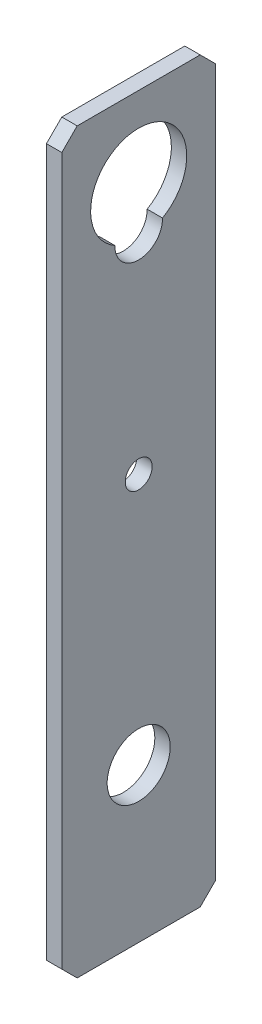
ISO-10303-21;
HEADER;
FILE_DESCRIPTION(('STEP AP214'),'2;1');
FILE_NAME('part.step','',(''),(''),'','','');
FILE_SCHEMA(('AUTOMOTIVE_DESIGN { 1 0 10303 214 1 1 1 1 }'));
ENDSEC;
DATA;
#1=APPLICATION_CONTEXT('core data for automotive mechanical design processes');
#2=APPLICATION_PROTOCOL_DEFINITION('international standard','automotive_design',2000,#1);
#3=PRODUCT_CONTEXT('',#1,'mechanical');
#4=PRODUCT('Part','Part','',(#3));
#5=PRODUCT_RELATED_PRODUCT_CATEGORY('part','',(#4));
#6=PRODUCT_DEFINITION_FORMATION('','',#4);
#7=PRODUCT_DEFINITION_CONTEXT('part definition',#1,'design');
#8=PRODUCT_DEFINITION('design','',#6,#7);
#9=PRODUCT_DEFINITION_SHAPE('','',#8);
#10=(LENGTH_UNIT() NAMED_UNIT(*) SI_UNIT(.MILLI.,.METRE.));
#11=(NAMED_UNIT(*) PLANE_ANGLE_UNIT() SI_UNIT($,.RADIAN.));
#12=(NAMED_UNIT(*) SI_UNIT($,.STERADIAN.) SOLID_ANGLE_UNIT());
#13=UNCERTAINTY_MEASURE_WITH_UNIT(LENGTH_MEASURE(1.E-05),#10,'distance_accuracy_value','');
#14=(GEOMETRIC_REPRESENTATION_CONTEXT(3) GLOBAL_UNCERTAINTY_ASSIGNED_CONTEXT((#13)) GLOBAL_UNIT_ASSIGNED_CONTEXT((#10,
#11,#12)) REPRESENTATION_CONTEXT('',''));
#15=CARTESIAN_POINT('',(0.,0.,0.));
#16=DIRECTION('',(0.,0.,1.));
#17=DIRECTION('',(1.,0.,0.));
#18=AXIS2_PLACEMENT_3D('',#15,#16,#17);
#19=CARTESIAN_POINT('',(2.,-48.,-10.));
#20=DIRECTION('',(0.,0.,1.));
#21=DIRECTION('',(1.,0.,0.));
#22=AXIS2_PLACEMENT_3D('',#19,#20,#21);
#23=PLANE('',#22);
#24=DIRECTION('',(0.,1.,0.));
#25=VECTOR('',#24,1.);
#26=CARTESIAN_POINT('',(2.,-48.,-10.));
#27=LINE('',#26,#25);
#28=CARTESIAN_POINT('',(2.,-46.,-10.));
#29=VERTEX_POINT('',#28);
#30=CARTESIAN_POINT('',(2.,46.,-10.));
#31=VERTEX_POINT('',#30);
#32=EDGE_CURVE('E170',#29,#31,#27,.T.);
#33=ORIENTED_EDGE('',*,*,#32,.F.);
#34=DIRECTION('',(-1.,0.,0.));
#35=VECTOR('',#34,1.);
#36=CARTESIAN_POINT('',(2.,-46.,-10.));
#37=LINE('',#36,#35);
#38=CARTESIAN_POINT('',(0.,-46.,-10.));
#39=VERTEX_POINT('',#38);
#40=EDGE_CURVE('E238',#29,#39,#37,.T.);
#41=ORIENTED_EDGE('',*,*,#40,.T.);
#42=DIRECTION('',(0.,1.,0.));
#43=VECTOR('',#42,1.);
#44=CARTESIAN_POINT('',(0.,-48.,-10.));
#45=LINE('',#44,#43);
#46=CARTESIAN_POINT('',(0.,46.,-10.));
#47=VERTEX_POINT('',#46);
#48=EDGE_CURVE('E165',#39,#47,#45,.T.);
#49=ORIENTED_EDGE('',*,*,#48,.T.);
#50=DIRECTION('',(1.,0.,0.));
#51=VECTOR('',#50,1.);
#52=CARTESIAN_POINT('',(2.,46.,-10.));
#53=LINE('',#52,#51);
#54=EDGE_CURVE('E235',#47,#31,#53,.T.);
#55=ORIENTED_EDGE('',*,*,#54,.T.);
#56=EDGE_LOOP('',(#33,#41,#49,#55));
#57=FACE_BOUND('',#56,.T.);
#58=ADVANCED_FACE('F47',(#57),#23,.F.);
#59=CARTESIAN_POINT('',(2.,48.,10.));
#60=DIRECTION('',(0.,-1.,0.));
#61=DIRECTION('',(0.,0.,-1.));
#62=AXIS2_PLACEMENT_3D('',#59,#60,#61);
#63=PLANE('',#62);
#64=DIRECTION('',(0.,0.,1.));
#65=VECTOR('',#64,1.);
#66=CARTESIAN_POINT('',(2.,48.,10.));
#67=LINE('',#66,#65);
#68=CARTESIAN_POINT('',(2.,48.,-8.));
#69=VERTEX_POINT('',#68);
#70=CARTESIAN_POINT('',(2.,48.,7.99999999999999));
#71=VERTEX_POINT('',#70);
#72=EDGE_CURVE('E173',#69,#71,#67,.T.);
#73=ORIENTED_EDGE('',*,*,#72,.F.);
#74=DIRECTION('',(-1.,0.,0.));
#75=VECTOR('',#74,1.);
#76=CARTESIAN_POINT('',(2.,48.,-8.));
#77=LINE('',#76,#75);
#78=CARTESIAN_POINT('',(0.,48.,-8.));
#79=VERTEX_POINT('',#78);
#80=EDGE_CURVE('E11',#69,#79,#77,.T.);
#81=ORIENTED_EDGE('',*,*,#80,.T.);
#82=DIRECTION('',(0.,0.,1.));
#83=VECTOR('',#82,1.);
#84=CARTESIAN_POINT('',(0.,48.,10.));
#85=LINE('',#84,#83);
#86=CARTESIAN_POINT('',(0.,48.,7.99999999999999));
#87=VERTEX_POINT('',#86);
#88=EDGE_CURVE('E189',#79,#87,#85,.T.);
#89=ORIENTED_EDGE('',*,*,#88,.T.);
#90=DIRECTION('',(1.,0.,0.));
#91=VECTOR('',#90,1.);
#92=CARTESIAN_POINT('',(2.,48.,7.99999999999999));
#93=LINE('',#92,#91);
#94=EDGE_CURVE('E57',#87,#71,#93,.T.);
#95=ORIENTED_EDGE('',*,*,#94,.T.);
#96=EDGE_LOOP('',(#73,#81,#89,#95));
#97=FACE_BOUND('',#96,.T.);
#98=ADVANCED_FACE('F283',(#97),#63,.F.);
#99=CARTESIAN_POINT('',(2.,-48.,10.));
#100=DIRECTION('',(0.,0.,-1.));
#101=DIRECTION('',(-1.,0.,0.));
#102=AXIS2_PLACEMENT_3D('',#99,#100,#101);
#103=PLANE('',#102);
#104=DIRECTION('',(0.,-1.,0.));
#105=VECTOR('',#104,1.);
#106=CARTESIAN_POINT('',(0.,-48.,10.));
#107=LINE('',#106,#105);
#108=CARTESIAN_POINT('',(0.,46.,10.));
#109=VERTEX_POINT('',#108);
#110=CARTESIAN_POINT('',(0.,-46.,10.));
#111=VERTEX_POINT('',#110);
#112=EDGE_CURVE('E192',#109,#111,#107,.T.);
#113=ORIENTED_EDGE('',*,*,#112,.T.);
#114=DIRECTION('',(1.,0.,0.));
#115=VECTOR('',#114,1.);
#116=CARTESIAN_POINT('',(2.,-46.,10.));
#117=LINE('',#116,#115);
#118=CARTESIAN_POINT('',(2.,-46.,10.));
#119=VERTEX_POINT('',#118);
#120=EDGE_CURVE('E221',#111,#119,#117,.T.);
#121=ORIENTED_EDGE('',*,*,#120,.T.);
#122=DIRECTION('',(0.,-1.,0.));
#123=VECTOR('',#122,1.);
#124=CARTESIAN_POINT('',(2.,-48.,10.));
#125=LINE('',#124,#123);
#126=CARTESIAN_POINT('',(2.,46.,10.));
#127=VERTEX_POINT('',#126);
#128=EDGE_CURVE('E177',#127,#119,#125,.T.);
#129=ORIENTED_EDGE('',*,*,#128,.F.);
#130=DIRECTION('',(-1.,0.,0.));
#131=VECTOR('',#130,1.);
#132=CARTESIAN_POINT('',(2.,46.,10.));
#133=LINE('',#132,#131);
#134=EDGE_CURVE('E217',#127,#109,#133,.T.);
#135=ORIENTED_EDGE('',*,*,#134,.T.);
#136=EDGE_LOOP('',(#113,#121,#129,#135));
#137=FACE_BOUND('',#136,.T.);
#138=ADVANCED_FACE('F285',(#137),#103,.F.);
#139=CARTESIAN_POINT('',(2.,-48.,10.));
#140=DIRECTION('',(0.,1.,0.));
#141=DIRECTION('',(0.,0.,1.));
#142=AXIS2_PLACEMENT_3D('',#139,#140,#141);
#143=PLANE('',#142);
#144=DIRECTION('',(0.,0.,-1.));
#145=VECTOR('',#144,1.);
#146=CARTESIAN_POINT('',(2.,-48.,10.));
#147=LINE('',#146,#145);
#148=CARTESIAN_POINT('',(2.,-48.,8.));
#149=VERTEX_POINT('',#148);
#150=CARTESIAN_POINT('',(2.,-48.,-7.99999999999998));
#151=VERTEX_POINT('',#150);
#152=EDGE_CURVE('E181',#149,#151,#147,.T.);
#153=ORIENTED_EDGE('',*,*,#152,.F.);
#154=DIRECTION('',(-1.,0.,0.));
#155=VECTOR('',#154,1.);
#156=CARTESIAN_POINT('',(2.,-48.,8.));
#157=LINE('',#156,#155);
#158=CARTESIAN_POINT('',(0.,-48.,8.));
#159=VERTEX_POINT('',#158);
#160=EDGE_CURVE('E201',#149,#159,#157,.T.);
#161=ORIENTED_EDGE('',*,*,#160,.T.);
#162=DIRECTION('',(0.,0.,-1.));
#163=VECTOR('',#162,1.);
#164=CARTESIAN_POINT('',(0.,-48.,10.));
#165=LINE('',#164,#163);
#166=CARTESIAN_POINT('',(0.,-48.,-7.99999999999998));
#167=VERTEX_POINT('',#166);
#168=EDGE_CURVE('E174',#159,#167,#165,.T.);
#169=ORIENTED_EDGE('',*,*,#168,.T.);
#170=DIRECTION('',(1.,0.,0.));
#171=VECTOR('',#170,1.);
#172=CARTESIAN_POINT('',(2.,-48.,-7.99999999999998));
#173=LINE('',#172,#171);
#174=EDGE_CURVE('E185',#167,#151,#173,.T.);
#175=ORIENTED_EDGE('',*,*,#174,.T.);
#176=EDGE_LOOP('',(#153,#161,#169,#175));
#177=FACE_BOUND('',#176,.T.);
#178=ADVANCED_FACE('F253',(#177),#143,.F.);
#179=CARTESIAN_POINT('',(2.,0.,0.));
#180=DIRECTION('',(-1.,0.,0.));
#181=DIRECTION('',(0.,0.,1.));
#182=AXIS2_PLACEMENT_3D('',#179,#180,#181);
#183=PLANE('',#182);
#184=CARTESIAN_POINT('',(2.,37.5,0.));
#185=DIRECTION('',(1.,0.,0.));
#186=DIRECTION('',(0.,0.,-1.));
#187=AXIS2_PLACEMENT_3D('',#184,#185,#186);
#188=CIRCLE('',#187,6.25);
#189=CARTESIAN_POINT('',(2.,32.0725,-3.09915210178526));
#190=VERTEX_POINT('',#189);
#191=CARTESIAN_POINT('',(2.,32.0725,3.09915210178526));
#192=VERTEX_POINT('',#191);
#193=EDGE_CURVE('E141',#190,#192,#188,.T.);
#194=ORIENTED_EDGE('',*,*,#193,.F.);
#195=CARTESIAN_POINT('',(2.,32.,0.));
#196=DIRECTION('',(1.,0.,0.));
#197=DIRECTION('',(0.,0.,-1.));
#198=AXIS2_PLACEMENT_3D('',#195,#196,#197);
#199=CIRCLE('',#198,3.1);
#200=EDGE_CURVE('E130',#192,#190,#199,.T.);
#201=ORIENTED_EDGE('',*,*,#200,.F.);
#202=EDGE_LOOP('',(#194,#201));
#203=FACE_BOUND('',#202,.T.);
#204=CARTESIAN_POINT('',(2.,-28.,0.));
#205=DIRECTION('',(1.,0.,0.));
#206=DIRECTION('',(0.,0.,-1.));
#207=AXIS2_PLACEMENT_3D('',#204,#205,#206);
#208=CIRCLE('',#207,4.1);
#209=CARTESIAN_POINT('',(2.,-28.,-4.1));
#210=VERTEX_POINT('',#209);
#211=EDGE_CURVE('E153',#210,#210,#208,.T.);
#212=ORIENTED_EDGE('',*,*,#211,.F.);
#213=EDGE_LOOP('',(#212));
#214=FACE_BOUND('',#213,.T.);
#215=CARTESIAN_POINT('',(2.,4.74999999999999,0.));
#216=DIRECTION('',(1.,0.,0.));
#217=DIRECTION('',(0.,0.,-1.));
#218=AXIS2_PLACEMENT_3D('',#215,#216,#217);
#219=CIRCLE('',#218,1.75);
#220=CARTESIAN_POINT('',(2.,4.74999999999999,-1.75));
#221=VERTEX_POINT('',#220);
#222=EDGE_CURVE('E166',#221,#221,#219,.T.);
#223=ORIENTED_EDGE('',*,*,#222,.F.);
#224=EDGE_LOOP('',(#223));
#225=FACE_BOUND('',#224,.T.);
#226=ORIENTED_EDGE('',*,*,#128,.T.);
#227=DIRECTION('',(0.,0.70710678118655,0.707106781186545));
#228=VECTOR('',#227,1.);
#229=CARTESIAN_POINT('',(2.,-48.,8.));
#230=LINE('',#229,#228);
#231=EDGE_CURVE('E232',#119,#149,#230,.F.);
#232=ORIENTED_EDGE('',*,*,#231,.T.);
#233=ORIENTED_EDGE('',*,*,#152,.T.);
#234=DIRECTION('',(0.,-0.707106781186545,0.70710678118655));
#235=VECTOR('',#234,1.);
#236=CARTESIAN_POINT('',(2.,-46.,-10.));
#237=LINE('',#236,#235);
#238=EDGE_CURVE('E229',#151,#29,#237,.F.);
#239=ORIENTED_EDGE('',*,*,#238,.T.);
#240=ORIENTED_EDGE('',*,*,#32,.T.);
#241=DIRECTION('',(0.,-0.70710678118655,-0.707106781186545));
#242=VECTOR('',#241,1.);
#243=CARTESIAN_POINT('',(2.,48.,-8.));
#244=LINE('',#243,#242);
#245=EDGE_CURVE('E70',#31,#69,#244,.F.);
#246=ORIENTED_EDGE('',*,*,#245,.T.);
#247=ORIENTED_EDGE('',*,*,#72,.T.);
#248=DIRECTION('',(0.,0.707106781186545,-0.70710678118655));
#249=VECTOR('',#248,1.);
#250=CARTESIAN_POINT('',(2.,46.,10.));
#251=LINE('',#250,#249);
#252=EDGE_CURVE('E224',#71,#127,#251,.F.);
#253=ORIENTED_EDGE('',*,*,#252,.T.);
#254=EDGE_LOOP('',(#226,#232,#233,#239,#240,#246,#247,#253));
#255=FACE_BOUND('',#254,.T.);
#256=ADVANCED_FACE('F146',(#203,#214,#225,#255),#183,.F.);
#257=CARTESIAN_POINT('',(0.,0.,0.));
#258=DIRECTION('',(-1.,0.,0.));
#259=DIRECTION('',(0.,0.,1.));
#260=AXIS2_PLACEMENT_3D('',#257,#258,#259);
#261=PLANE('',#260);
#262=CARTESIAN_POINT('',(0.,32.,0.));
#263=DIRECTION('',(1.,0.,0.));
#264=DIRECTION('',(0.,0.,-1.));
#265=AXIS2_PLACEMENT_3D('',#262,#263,#264);
#266=CIRCLE('',#265,3.1);
#267=CARTESIAN_POINT('',(0.,32.0725,3.09915210178526));
#268=VERTEX_POINT('',#267);
#269=CARTESIAN_POINT('',(0.,32.0725,-3.09915210178526));
#270=VERTEX_POINT('',#269);
#271=EDGE_CURVE('E133',#268,#270,#266,.T.);
#272=ORIENTED_EDGE('',*,*,#271,.T.);
#273=CARTESIAN_POINT('',(0.,37.5,0.));
#274=DIRECTION('',(1.,0.,0.));
#275=DIRECTION('',(0.,0.,-1.));
#276=AXIS2_PLACEMENT_3D('',#273,#274,#275);
#277=CIRCLE('',#276,6.25);
#278=EDGE_CURVE('E156',#270,#268,#277,.T.);
#279=ORIENTED_EDGE('',*,*,#278,.T.);
#280=EDGE_LOOP('',(#272,#279));
#281=FACE_BOUND('',#280,.T.);
#282=CARTESIAN_POINT('',(0.,-28.,0.));
#283=DIRECTION('',(1.,0.,0.));
#284=DIRECTION('',(0.,0.,-1.));
#285=AXIS2_PLACEMENT_3D('',#282,#283,#284);
#286=CIRCLE('',#285,4.1);
#287=CARTESIAN_POINT('',(0.,-28.,-4.1));
#288=VERTEX_POINT('',#287);
#289=EDGE_CURVE('E149',#288,#288,#286,.T.);
#290=ORIENTED_EDGE('',*,*,#289,.T.);
#291=EDGE_LOOP('',(#290));
#292=FACE_BOUND('',#291,.T.);
#293=CARTESIAN_POINT('',(0.,4.74999999999999,0.));
#294=DIRECTION('',(1.,0.,0.));
#295=DIRECTION('',(0.,0.,-1.));
#296=AXIS2_PLACEMENT_3D('',#293,#294,#295);
#297=CIRCLE('',#296,1.75);
#298=CARTESIAN_POINT('',(0.,4.74999999999999,-1.75));
#299=VERTEX_POINT('',#298);
#300=EDGE_CURVE('E161',#299,#299,#297,.T.);
#301=ORIENTED_EDGE('',*,*,#300,.T.);
#302=EDGE_LOOP('',(#301));
#303=FACE_BOUND('',#302,.T.);
#304=ORIENTED_EDGE('',*,*,#168,.F.);
#305=DIRECTION('',(0.,-0.70710678118655,-0.707106781186545));
#306=VECTOR('',#305,1.);
#307=CARTESIAN_POINT('',(0.,-27.9999999999998,28.));
#308=LINE('',#307,#306);
#309=EDGE_CURVE('E214',#159,#111,#308,.F.);
#310=ORIENTED_EDGE('',*,*,#309,.T.);
#311=ORIENTED_EDGE('',*,*,#112,.F.);
#312=DIRECTION('',(0.,-0.707106781186545,0.70710678118655));
#313=VECTOR('',#312,1.);
#314=CARTESIAN_POINT('',(0.,28.0000000000002,28.));
#315=LINE('',#314,#313);
#316=EDGE_CURVE('E205',#109,#87,#315,.F.);
#317=ORIENTED_EDGE('',*,*,#316,.T.);
#318=ORIENTED_EDGE('',*,*,#88,.F.);
#319=DIRECTION('',(0.,0.70710678118655,0.707106781186545));
#320=VECTOR('',#319,1.);
#321=CARTESIAN_POINT('',(0.,27.9999999999998,-28.));
#322=LINE('',#321,#320);
#323=EDGE_CURVE('E208',#79,#47,#322,.F.);
#324=ORIENTED_EDGE('',*,*,#323,.T.);
#325=ORIENTED_EDGE('',*,*,#48,.F.);
#326=DIRECTION('',(0.,0.707106781186545,-0.70710678118655));
#327=VECTOR('',#326,1.);
#328=CARTESIAN_POINT('',(0.,-28.0000000000002,-28.));
#329=LINE('',#328,#327);
#330=EDGE_CURVE('E211',#39,#167,#329,.F.);
#331=ORIENTED_EDGE('',*,*,#330,.T.);
#332=EDGE_LOOP('',(#304,#310,#311,#317,#318,#324,#325,#331));
#333=FACE_BOUND('',#332,.T.);
#334=ADVANCED_FACE('F252',(#281,#292,#303,#333),#261,.T.);
#335=CARTESIAN_POINT('',(0.,4.74999999999999,0.));
#336=DIRECTION('',(1.,0.,0.));
#337=DIRECTION('',(0.,0.,-1.));
#338=AXIS2_PLACEMENT_3D('',#335,#336,#337);
#339=CYLINDRICAL_SURFACE('',#338,1.75);
#340=ORIENTED_EDGE('',*,*,#300,.F.);
#341=EDGE_LOOP('',(#340));
#342=FACE_BOUND('',#341,.T.);
#343=ORIENTED_EDGE('',*,*,#222,.T.);
#344=EDGE_LOOP('',(#343));
#345=FACE_BOUND('',#344,.T.);
#346=ADVANCED_FACE('F360',(#342,#345),#339,.F.);
#347=CARTESIAN_POINT('',(0.,-28.,0.));
#348=DIRECTION('',(1.,0.,0.));
#349=DIRECTION('',(0.,0.,-1.));
#350=AXIS2_PLACEMENT_3D('',#347,#348,#349);
#351=CYLINDRICAL_SURFACE('',#350,4.1);
#352=ORIENTED_EDGE('',*,*,#289,.F.);
#353=EDGE_LOOP('',(#352));
#354=FACE_BOUND('',#353,.T.);
#355=ORIENTED_EDGE('',*,*,#211,.T.);
#356=EDGE_LOOP('',(#355));
#357=FACE_BOUND('',#356,.T.);
#358=ADVANCED_FACE('F249',(#354,#357),#351,.F.);
#359=CARTESIAN_POINT('',(0.,32.,0.));
#360=DIRECTION('',(1.,0.,0.));
#361=DIRECTION('',(0.,0.,-1.));
#362=AXIS2_PLACEMENT_3D('',#359,#360,#361);
#363=CYLINDRICAL_SURFACE('',#362,3.1);
#364=ORIENTED_EDGE('',*,*,#200,.T.);
#365=DIRECTION('',(1.,0.,0.));
#366=VECTOR('',#365,1.);
#367=CARTESIAN_POINT('',(0.,32.0725,-3.09915210178526));
#368=LINE('',#367,#366);
#369=EDGE_CURVE('E138',#270,#190,#368,.T.);
#370=ORIENTED_EDGE('',*,*,#369,.F.);
#371=ORIENTED_EDGE('',*,*,#271,.F.);
#372=DIRECTION('',(1.,0.,0.));
#373=VECTOR('',#372,1.);
#374=CARTESIAN_POINT('',(0.,32.0725,3.09915210178526));
#375=LINE('',#374,#373);
#376=EDGE_CURVE('E126',#268,#192,#375,.T.);
#377=ORIENTED_EDGE('',*,*,#376,.T.);
#378=EDGE_LOOP('',(#364,#370,#371,#377));
#379=FACE_BOUND('',#378,.T.);
#380=ADVANCED_FACE('F128',(#379),#363,.F.);
#381=CARTESIAN_POINT('',(0.,37.5,0.));
#382=DIRECTION('',(1.,0.,0.));
#383=DIRECTION('',(0.,0.,-1.));
#384=AXIS2_PLACEMENT_3D('',#381,#382,#383);
#385=CYLINDRICAL_SURFACE('',#384,6.25);
#386=ORIENTED_EDGE('',*,*,#193,.T.);
#387=ORIENTED_EDGE('',*,*,#376,.F.);
#388=ORIENTED_EDGE('',*,*,#278,.F.);
#389=ORIENTED_EDGE('',*,*,#369,.T.);
#390=EDGE_LOOP('',(#386,#387,#388,#389));
#391=FACE_BOUND('',#390,.T.);
#392=ADVANCED_FACE('F142',(#391),#385,.F.);
#393=CARTESIAN_POINT('',(2.,-48.,8.));
#394=DIRECTION('',(0.,0.707106781186545,-0.70710678118655));
#395=DIRECTION('',(-1.,0.,0.));
#396=AXIS2_PLACEMENT_3D('',#393,#394,#395);
#397=PLANE('',#396);
#398=ORIENTED_EDGE('',*,*,#231,.F.);
#399=ORIENTED_EDGE('',*,*,#120,.F.);
#400=ORIENTED_EDGE('',*,*,#309,.F.);
#401=ORIENTED_EDGE('',*,*,#160,.F.);
#402=EDGE_LOOP('',(#398,#399,#400,#401));
#403=FACE_BOUND('',#402,.T.);
#404=ADVANCED_FACE('F265',(#403),#397,.F.);
#405=CARTESIAN_POINT('',(2.,-46.,-10.));
#406=DIRECTION('',(0.,0.70710678118655,0.707106781186545));
#407=DIRECTION('',(-1.,0.,0.));
#408=AXIS2_PLACEMENT_3D('',#405,#406,#407);
#409=PLANE('',#408);
#410=ORIENTED_EDGE('',*,*,#238,.F.);
#411=ORIENTED_EDGE('',*,*,#174,.F.);
#412=ORIENTED_EDGE('',*,*,#330,.F.);
#413=ORIENTED_EDGE('',*,*,#40,.F.);
#414=EDGE_LOOP('',(#410,#411,#412,#413));
#415=FACE_BOUND('',#414,.T.);
#416=ADVANCED_FACE('F275',(#415),#409,.F.);
#417=CARTESIAN_POINT('',(2.,48.,-8.));
#418=DIRECTION('',(0.,-0.707106781186545,0.70710678118655));
#419=DIRECTION('',(-1.,0.,0.));
#420=AXIS2_PLACEMENT_3D('',#417,#418,#419);
#421=PLANE('',#420);
#422=ORIENTED_EDGE('',*,*,#245,.F.);
#423=ORIENTED_EDGE('',*,*,#54,.F.);
#424=ORIENTED_EDGE('',*,*,#323,.F.);
#425=ORIENTED_EDGE('',*,*,#80,.F.);
#426=EDGE_LOOP('',(#422,#423,#424,#425));
#427=FACE_BOUND('',#426,.T.);
#428=ADVANCED_FACE('F281',(#427),#421,.F.);
#429=CARTESIAN_POINT('',(2.,46.,10.));
#430=DIRECTION('',(0.,-0.70710678118655,-0.707106781186545));
#431=DIRECTION('',(-1.,0.,0.));
#432=AXIS2_PLACEMENT_3D('',#429,#430,#431);
#433=PLANE('',#432);
#434=ORIENTED_EDGE('',*,*,#252,.F.);
#435=ORIENTED_EDGE('',*,*,#94,.F.);
#436=ORIENTED_EDGE('',*,*,#316,.F.);
#437=ORIENTED_EDGE('',*,*,#134,.F.);
#438=EDGE_LOOP('',(#434,#435,#436,#437));
#439=FACE_BOUND('',#438,.T.);
#440=ADVANCED_FACE('F50',(#439),#433,.F.);
#441=CLOSED_SHELL('',(#58,#98,#138,#178,#256,#334,#346,#358,#380,#392,#404,#416,#428,#440));
#442=MANIFOLD_SOLID_BREP('B2',#441);
#443=ADVANCED_BREP_SHAPE_REPRESENTATION('',(#18,#442),#14);
#444=SHAPE_DEFINITION_REPRESENTATION(#9,#443);
ENDSEC;
END-ISO-10303-21;
